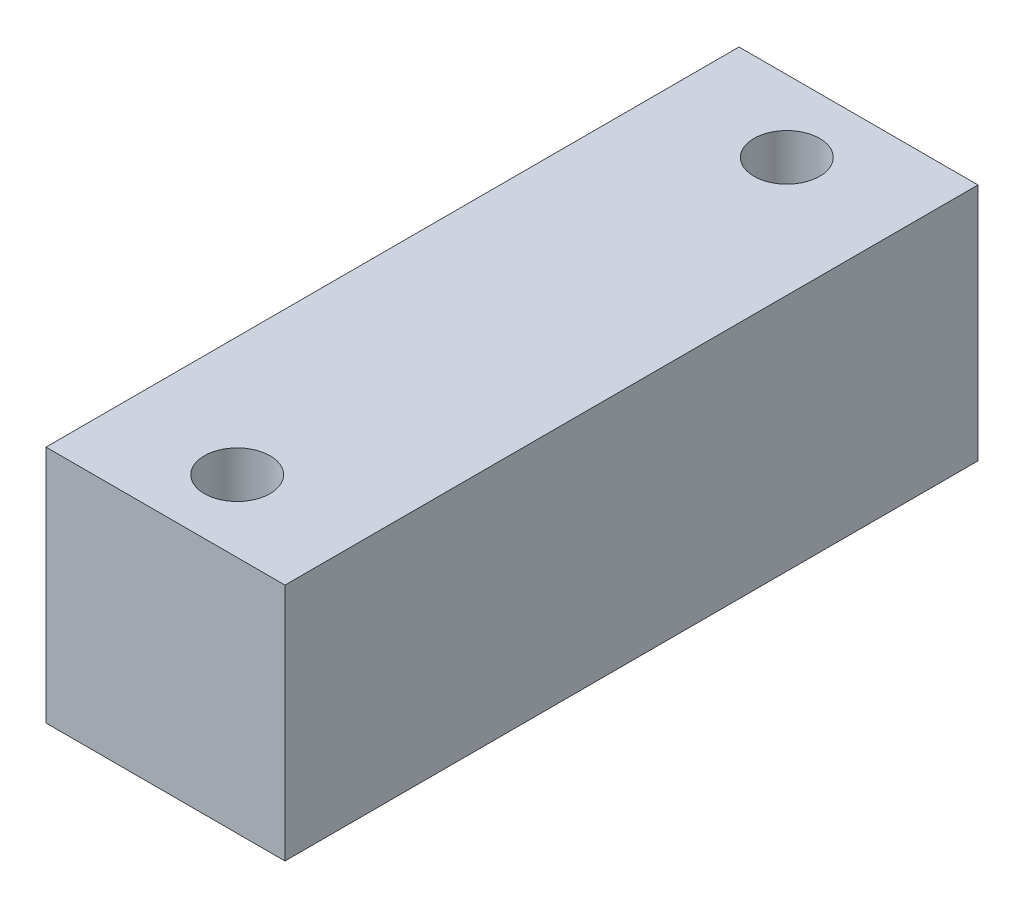
ISO-10303-21;
HEADER;
FILE_DESCRIPTION(('STEP AP214'),'2;1');
FILE_NAME('part.step','',(''),(''),'','','');
FILE_SCHEMA(('AUTOMOTIVE_DESIGN { 1 0 10303 214 1 1 1 1 }'));
ENDSEC;
DATA;
#1=APPLICATION_CONTEXT('core data for automotive mechanical design processes');
#2=APPLICATION_PROTOCOL_DEFINITION('international standard','automotive_design',2000,#1);
#3=PRODUCT_CONTEXT('',#1,'mechanical');
#4=PRODUCT('Part','Part','',(#3));
#5=PRODUCT_RELATED_PRODUCT_CATEGORY('part','',(#4));
#6=PRODUCT_DEFINITION_FORMATION('','',#4);
#7=PRODUCT_DEFINITION_CONTEXT('part definition',#1,'design');
#8=PRODUCT_DEFINITION('design','',#6,#7);
#9=PRODUCT_DEFINITION_SHAPE('','',#8);
#10=(LENGTH_UNIT() NAMED_UNIT(*) SI_UNIT(.MILLI.,.METRE.));
#11=(NAMED_UNIT(*) PLANE_ANGLE_UNIT() SI_UNIT($,.RADIAN.));
#12=(NAMED_UNIT(*) SI_UNIT($,.STERADIAN.) SOLID_ANGLE_UNIT());
#13=UNCERTAINTY_MEASURE_WITH_UNIT(LENGTH_MEASURE(1.E-05),#10,'distance_accuracy_value','');
#14=(GEOMETRIC_REPRESENTATION_CONTEXT(3) GLOBAL_UNCERTAINTY_ASSIGNED_CONTEXT((#13)) GLOBAL_UNIT_ASSIGNED_CONTEXT((#10,
#11,#12)) REPRESENTATION_CONTEXT('',''));
#15=CARTESIAN_POINT('',(0.,0.,0.));
#16=DIRECTION('',(0.,0.,1.));
#17=DIRECTION('',(1.,0.,0.));
#18=AXIS2_PLACEMENT_3D('',#15,#16,#17);
#19=CARTESIAN_POINT('',(10.,-10.,58.));
#20=DIRECTION('',(-1.,0.,0.));
#21=DIRECTION('',(0.,0.,1.));
#22=AXIS2_PLACEMENT_3D('',#19,#20,#21);
#23=PLANE('',#22);
#24=DIRECTION('',(0.,1.,0.));
#25=VECTOR('',#24,1.);
#26=CARTESIAN_POINT('',(10.,-10.,0.));
#27=LINE('',#26,#25);
#28=CARTESIAN_POINT('',(10.,-10.,0.));
#29=VERTEX_POINT('',#28);
#30=CARTESIAN_POINT('',(10.,10.,0.));
#31=VERTEX_POINT('',#30);
#32=EDGE_CURVE('E104',#29,#31,#27,.T.);
#33=ORIENTED_EDGE('',*,*,#32,.T.);
#34=DIRECTION('',(0.,0.,-1.));
#35=VECTOR('',#34,1.);
#36=CARTESIAN_POINT('',(10.,10.,58.));
#37=LINE('',#36,#35);
#38=CARTESIAN_POINT('',(10.,10.,58.));
#39=VERTEX_POINT('',#38);
#40=EDGE_CURVE('E11',#39,#31,#37,.T.);
#41=ORIENTED_EDGE('',*,*,#40,.F.);
#42=DIRECTION('',(0.,1.,0.));
#43=VECTOR('',#42,1.);
#44=CARTESIAN_POINT('',(10.,-10.,58.));
#45=LINE('',#44,#43);
#46=CARTESIAN_POINT('',(10.,-10.,58.));
#47=VERTEX_POINT('',#46);
#48=EDGE_CURVE('E92',#47,#39,#45,.T.);
#49=ORIENTED_EDGE('',*,*,#48,.F.);
#50=DIRECTION('',(0.,0.,-1.));
#51=VECTOR('',#50,1.);
#52=CARTESIAN_POINT('',(10.,-10.,58.));
#53=LINE('',#52,#51);
#54=EDGE_CURVE('E100',#47,#29,#53,.T.);
#55=ORIENTED_EDGE('',*,*,#54,.T.);
#56=EDGE_LOOP('',(#33,#41,#49,#55));
#57=FACE_BOUND('',#56,.T.);
#58=ADVANCED_FACE('F41',(#57),#23,.F.);
#59=CARTESIAN_POINT('',(-10.,10.,58.));
#60=DIRECTION('',(0.,-1.,0.));
#61=DIRECTION('',(0.,0.,-1.));
#62=AXIS2_PLACEMENT_3D('',#59,#60,#61);
#63=PLANE('',#62);
#64=CARTESIAN_POINT('',(0.,10.,6.));
#65=DIRECTION('',(0.,1.,0.));
#66=DIRECTION('',(0.,0.,1.));
#67=AXIS2_PLACEMENT_3D('',#64,#65,#66);
#68=CIRCLE('',#67,2.75);
#69=CARTESIAN_POINT('',(0.,10.,8.75));
#70=VERTEX_POINT('',#69);
#71=EDGE_CURVE('E124',#70,#70,#68,.T.);
#72=ORIENTED_EDGE('',*,*,#71,.F.);
#73=EDGE_LOOP('',(#72));
#74=FACE_BOUND('',#73,.T.);
#75=CARTESIAN_POINT('',(0.,10.,52.));
#76=DIRECTION('',(0.,1.,0.));
#77=DIRECTION('',(0.,0.,-1.));
#78=AXIS2_PLACEMENT_3D('',#75,#76,#77);
#79=CIRCLE('',#78,2.75);
#80=CARTESIAN_POINT('',(0.,10.,49.25));
#81=VERTEX_POINT('',#80);
#82=EDGE_CURVE('E121',#81,#81,#79,.T.);
#83=ORIENTED_EDGE('',*,*,#82,.F.);
#84=EDGE_LOOP('',(#83));
#85=FACE_BOUND('',#84,.T.);
#86=DIRECTION('',(-1.,0.,0.));
#87=VECTOR('',#86,1.);
#88=CARTESIAN_POINT('',(-10.,10.,0.));
#89=LINE('',#88,#87);
#90=CARTESIAN_POINT('',(-10.,10.,0.));
#91=VERTEX_POINT('',#90);
#92=EDGE_CURVE('E96',#31,#91,#89,.T.);
#93=ORIENTED_EDGE('',*,*,#92,.T.);
#94=DIRECTION('',(0.,0.,-1.));
#95=VECTOR('',#94,1.);
#96=CARTESIAN_POINT('',(-10.,10.,58.));
#97=LINE('',#96,#95);
#98=CARTESIAN_POINT('',(-10.,10.,58.));
#99=VERTEX_POINT('',#98);
#100=EDGE_CURVE('E49',#99,#91,#97,.T.);
#101=ORIENTED_EDGE('',*,*,#100,.F.);
#102=DIRECTION('',(-1.,0.,0.));
#103=VECTOR('',#102,1.);
#104=CARTESIAN_POINT('',(-10.,10.,58.));
#105=LINE('',#104,#103);
#106=EDGE_CURVE('E87',#39,#99,#105,.T.);
#107=ORIENTED_EDGE('',*,*,#106,.F.);
#108=ORIENTED_EDGE('',*,*,#40,.T.);
#109=EDGE_LOOP('',(#93,#101,#107,#108));
#110=FACE_BOUND('',#109,.T.);
#111=ADVANCED_FACE('F95',(#74,#85,#110),#63,.F.);
#112=CARTESIAN_POINT('',(-10.,-10.,58.));
#113=DIRECTION('',(1.,0.,0.));
#114=DIRECTION('',(0.,0.,-1.));
#115=AXIS2_PLACEMENT_3D('',#112,#113,#114);
#116=PLANE('',#115);
#117=DIRECTION('',(0.,-1.,0.));
#118=VECTOR('',#117,1.);
#119=CARTESIAN_POINT('',(-10.,-10.,0.));
#120=LINE('',#119,#118);
#121=CARTESIAN_POINT('',(-10.,-10.,0.));
#122=VERTEX_POINT('',#121);
#123=EDGE_CURVE('E74',#91,#122,#120,.T.);
#124=ORIENTED_EDGE('',*,*,#123,.T.);
#125=DIRECTION('',(0.,0.,-1.));
#126=VECTOR('',#125,1.);
#127=CARTESIAN_POINT('',(-10.,-10.,58.));
#128=LINE('',#127,#126);
#129=CARTESIAN_POINT('',(-10.,-10.,58.));
#130=VERTEX_POINT('',#129);
#131=EDGE_CURVE('E97',#130,#122,#128,.T.);
#132=ORIENTED_EDGE('',*,*,#131,.F.);
#133=DIRECTION('',(0.,-1.,0.));
#134=VECTOR('',#133,1.);
#135=CARTESIAN_POINT('',(-10.,-10.,58.));
#136=LINE('',#135,#134);
#137=EDGE_CURVE('E90',#99,#130,#136,.T.);
#138=ORIENTED_EDGE('',*,*,#137,.F.);
#139=ORIENTED_EDGE('',*,*,#100,.T.);
#140=EDGE_LOOP('',(#124,#132,#138,#139));
#141=FACE_BOUND('',#140,.T.);
#142=ADVANCED_FACE('F98',(#141),#116,.F.);
#143=CARTESIAN_POINT('',(-10.,-10.,58.));
#144=DIRECTION('',(0.,1.,0.));
#145=DIRECTION('',(0.,0.,1.));
#146=AXIS2_PLACEMENT_3D('',#143,#144,#145);
#147=PLANE('',#146);
#148=CARTESIAN_POINT('',(0.,-10.,6.));
#149=DIRECTION('',(0.,1.,0.));
#150=DIRECTION('',(0.,0.,1.));
#151=AXIS2_PLACEMENT_3D('',#148,#149,#150);
#152=CIRCLE('',#151,2.75);
#153=CARTESIAN_POINT('',(0.,-10.,8.75));
#154=VERTEX_POINT('',#153);
#155=EDGE_CURVE('E107',#154,#154,#152,.T.);
#156=ORIENTED_EDGE('',*,*,#155,.T.);
#157=EDGE_LOOP('',(#156));
#158=FACE_BOUND('',#157,.T.);
#159=CARTESIAN_POINT('',(0.,-10.,52.));
#160=DIRECTION('',(0.,1.,0.));
#161=DIRECTION('',(0.,0.,-1.));
#162=AXIS2_PLACEMENT_3D('',#159,#160,#161);
#163=CIRCLE('',#162,2.75);
#164=CARTESIAN_POINT('',(0.,-10.,49.25));
#165=VERTEX_POINT('',#164);
#166=EDGE_CURVE('E118',#165,#165,#163,.T.);
#167=ORIENTED_EDGE('',*,*,#166,.T.);
#168=EDGE_LOOP('',(#167));
#169=FACE_BOUND('',#168,.T.);
#170=DIRECTION('',(1.,0.,0.));
#171=VECTOR('',#170,1.);
#172=CARTESIAN_POINT('',(-10.,-10.,0.));
#173=LINE('',#172,#171);
#174=EDGE_CURVE('E80',#122,#29,#173,.T.);
#175=ORIENTED_EDGE('',*,*,#174,.T.);
#176=ORIENTED_EDGE('',*,*,#54,.F.);
#177=DIRECTION('',(1.,0.,0.));
#178=VECTOR('',#177,1.);
#179=CARTESIAN_POINT('',(-10.,-10.,58.));
#180=LINE('',#179,#178);
#181=EDGE_CURVE('E57',#130,#47,#180,.T.);
#182=ORIENTED_EDGE('',*,*,#181,.F.);
#183=ORIENTED_EDGE('',*,*,#131,.T.);
#184=EDGE_LOOP('',(#175,#176,#182,#183));
#185=FACE_BOUND('',#184,.T.);
#186=ADVANCED_FACE('F112',(#158,#169,#185),#147,.F.);
#187=CARTESIAN_POINT('',(0.,0.,58.));
#188=DIRECTION('',(0.,0.,-1.));
#189=DIRECTION('',(-1.,0.,0.));
#190=AXIS2_PLACEMENT_3D('',#187,#188,#189);
#191=PLANE('',#190);
#192=ORIENTED_EDGE('',*,*,#48,.T.);
#193=ORIENTED_EDGE('',*,*,#106,.T.);
#194=ORIENTED_EDGE('',*,*,#137,.T.);
#195=ORIENTED_EDGE('',*,*,#181,.T.);
#196=EDGE_LOOP('',(#192,#193,#194,#195));
#197=FACE_BOUND('',#196,.T.);
#198=ADVANCED_FACE('F88',(#197),#191,.F.);
#199=CARTESIAN_POINT('',(0.,0.,0.));
#200=DIRECTION('',(0.,0.,-1.));
#201=DIRECTION('',(-1.,0.,0.));
#202=AXIS2_PLACEMENT_3D('',#199,#200,#201);
#203=PLANE('',#202);
#204=ORIENTED_EDGE('',*,*,#32,.F.);
#205=ORIENTED_EDGE('',*,*,#174,.F.);
#206=ORIENTED_EDGE('',*,*,#123,.F.);
#207=ORIENTED_EDGE('',*,*,#92,.F.);
#208=EDGE_LOOP('',(#204,#205,#206,#207));
#209=FACE_BOUND('',#208,.T.);
#210=ADVANCED_FACE('F115',(#209),#203,.T.);
#211=CARTESIAN_POINT('',(0.,-10.,52.));
#212=DIRECTION('',(0.,1.,0.));
#213=DIRECTION('',(0.,0.,1.));
#214=AXIS2_PLACEMENT_3D('',#211,#212,#213);
#215=CYLINDRICAL_SURFACE('',#214,2.75);
#216=ORIENTED_EDGE('',*,*,#166,.F.);
#217=EDGE_LOOP('',(#216));
#218=FACE_BOUND('',#217,.T.);
#219=ORIENTED_EDGE('',*,*,#82,.T.);
#220=EDGE_LOOP('',(#219));
#221=FACE_BOUND('',#220,.T.);
#222=ADVANCED_FACE('F135',(#218,#221),#215,.F.);
#223=CARTESIAN_POINT('',(0.,-10.,6.));
#224=DIRECTION('',(0.,1.,0.));
#225=DIRECTION('',(0.,0.,1.));
#226=AXIS2_PLACEMENT_3D('',#223,#224,#225);
#227=CYLINDRICAL_SURFACE('',#226,2.75);
#228=ORIENTED_EDGE('',*,*,#155,.F.);
#229=EDGE_LOOP('',(#228));
#230=FACE_BOUND('',#229,.T.);
#231=ORIENTED_EDGE('',*,*,#71,.T.);
#232=EDGE_LOOP('',(#231));
#233=FACE_BOUND('',#232,.T.);
#234=ADVANCED_FACE('F132',(#230,#233),#227,.F.);
#235=CLOSED_SHELL('',(#58,#111,#142,#186,#198,#210,#222,#234));
#236=MANIFOLD_SOLID_BREP('B2',#235);
#237=ADVANCED_BREP_SHAPE_REPRESENTATION('',(#18,#236),#14);
#238=SHAPE_DEFINITION_REPRESENTATION(#9,#237);
ENDSEC;
END-ISO-10303-21;
